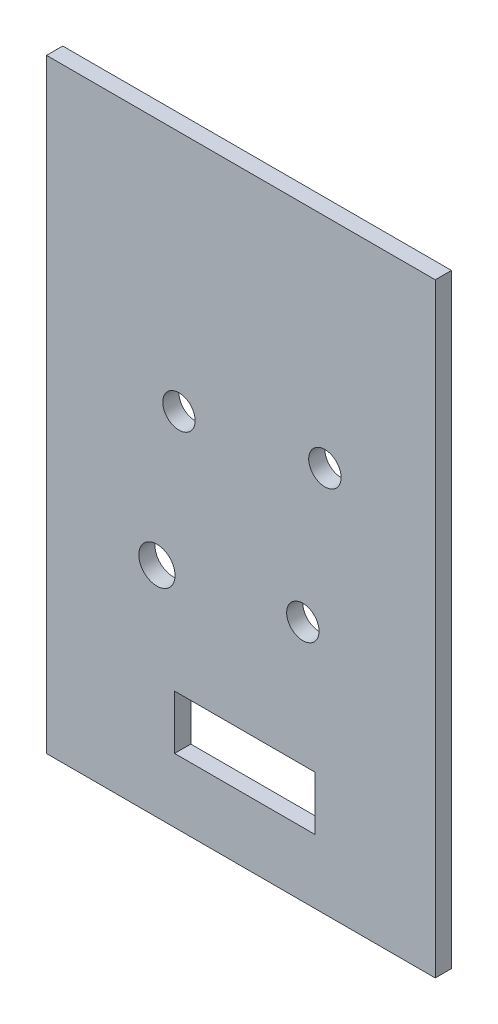
ISO-10303-21;
HEADER;
FILE_DESCRIPTION(('STEP AP214'),'2;1');
FILE_NAME('part.step','',(''),(''),'','','');
FILE_SCHEMA(('AUTOMOTIVE_DESIGN { 1 0 10303 214 1 1 1 1 }'));
ENDSEC;
DATA;
#1=APPLICATION_CONTEXT('core data for automotive mechanical design processes');
#2=APPLICATION_PROTOCOL_DEFINITION('international standard','automotive_design',2000,#1);
#3=PRODUCT_CONTEXT('',#1,'mechanical');
#4=PRODUCT('Part','Part','',(#3));
#5=PRODUCT_RELATED_PRODUCT_CATEGORY('part','',(#4));
#6=PRODUCT_DEFINITION_FORMATION('','',#4);
#7=PRODUCT_DEFINITION_CONTEXT('part definition',#1,'design');
#8=PRODUCT_DEFINITION('design','',#6,#7);
#9=PRODUCT_DEFINITION_SHAPE('','',#8);
#10=(LENGTH_UNIT() NAMED_UNIT(*) SI_UNIT(.MILLI.,.METRE.));
#11=(NAMED_UNIT(*) PLANE_ANGLE_UNIT() SI_UNIT($,.RADIAN.));
#12=(NAMED_UNIT(*) SI_UNIT($,.STERADIAN.) SOLID_ANGLE_UNIT());
#13=UNCERTAINTY_MEASURE_WITH_UNIT(LENGTH_MEASURE(1.E-05),#10,'distance_accuracy_value','');
#14=(GEOMETRIC_REPRESENTATION_CONTEXT(3) GLOBAL_UNCERTAINTY_ASSIGNED_CONTEXT((#13)) GLOBAL_UNIT_ASSIGNED_CONTEXT((#10,
#11,#12)) REPRESENTATION_CONTEXT('',''));
#15=CARTESIAN_POINT('',(0.,0.,0.));
#16=DIRECTION('',(0.,0.,1.));
#17=DIRECTION('',(1.,0.,0.));
#18=AXIS2_PLACEMENT_3D('',#15,#16,#17);
#19=CARTESIAN_POINT('',(0.,0.,1.5));
#20=DIRECTION('',(0.,0.,1.));
#21=DIRECTION('',(1.,0.,0.));
#22=AXIS2_PLACEMENT_3D('',#19,#20,#21);
#23=PLANE('',#22);
#24=CARTESIAN_POINT('',(-7.77817459305202,-7.77817459305202,1.5));
#25=DIRECTION('',(0.,0.,1.));
#26=DIRECTION('',(1.,0.,0.));
#27=AXIS2_PLACEMENT_3D('',#24,#25,#26);
#28=CIRCLE('',#27,1.6804092266645);
#29=CARTESIAN_POINT('',(-6.09776536638752,-7.77817459305202,1.5));
#30=VERTEX_POINT('',#29);
#31=EDGE_CURVE('E367',#30,#30,#28,.T.);
#32=ORIENTED_EDGE('',*,*,#31,.F.);
#33=EDGE_LOOP('',(#32));
#34=FACE_BOUND('',#33,.T.);
#35=DIRECTION('',(1.,0.,0.));
#36=VECTOR('',#35,1.);
#37=CARTESIAN_POINT('',(-6.14148069116993,-22.0593412620467,1.5));
#38=LINE('',#37,#36);
#39=CARTESIAN_POINT('',(-6.14148069116993,-22.0593412620467,1.5));
#40=VERTEX_POINT('',#39);
#41=CARTESIAN_POINT('',(6.85851930883007,-22.0593412620467,1.5));
#42=VERTEX_POINT('',#41);
#43=EDGE_CURVE('E114',#40,#42,#38,.T.);
#44=ORIENTED_EDGE('',*,*,#43,.F.);
#45=DIRECTION('',(0.,-1.,0.));
#46=VECTOR('',#45,1.);
#47=CARTESIAN_POINT('',(-6.14148069116993,-17.0593412620467,1.5));
#48=LINE('',#47,#46);
#49=CARTESIAN_POINT('',(-6.14148069116993,-17.0593412620467,1.5));
#50=VERTEX_POINT('',#49);
#51=EDGE_CURVE('E105',#50,#40,#48,.T.);
#52=ORIENTED_EDGE('',*,*,#51,.F.);
#53=DIRECTION('',(-1.,0.,0.));
#54=VECTOR('',#53,1.);
#55=CARTESIAN_POINT('',(-6.14148069116993,-17.0593412620467,1.5));
#56=LINE('',#55,#54);
#57=CARTESIAN_POINT('',(6.85851930883007,-17.0593412620467,1.5));
#58=VERTEX_POINT('',#57);
#59=EDGE_CURVE('E132',#58,#50,#56,.T.);
#60=ORIENTED_EDGE('',*,*,#59,.F.);
#61=DIRECTION('',(0.,1.,0.));
#62=VECTOR('',#61,1.);
#63=CARTESIAN_POINT('',(6.85851930883007,-17.0593412620467,1.5));
#64=LINE('',#63,#62);
#65=EDGE_CURVE('E128',#42,#58,#64,.T.);
#66=ORIENTED_EDGE('',*,*,#65,.F.);
#67=EDGE_LOOP('',(#44,#52,#60,#66));
#68=FACE_BOUND('',#67,.T.);
#69=CARTESIAN_POINT('',(7.77817459305202,7.77817459305202,1.5));
#70=DIRECTION('',(0.,0.,1.));
#71=DIRECTION('',(1.,0.,0.));
#72=AXIS2_PLACEMENT_3D('',#69,#70,#71);
#73=CIRCLE('',#72,1.5);
#74=CARTESIAN_POINT('',(9.27817459305203,7.77817459305202,1.5));
#75=VERTEX_POINT('',#74);
#76=EDGE_CURVE('E156',#75,#75,#73,.T.);
#77=ORIENTED_EDGE('',*,*,#76,.F.);
#78=EDGE_LOOP('',(#77));
#79=FACE_BOUND('',#78,.T.);
#80=DIRECTION('',(0.,-1.,0.));
#81=VECTOR('',#80,1.);
#82=CARTESIAN_POINT('',(-18.,0.,1.5));
#83=LINE('',#82,#81);
#84=CARTESIAN_POINT('',(-18.,28.,1.5));
#85=VERTEX_POINT('',#84);
#86=CARTESIAN_POINT('',(-18.,-28.,1.5));
#87=VERTEX_POINT('',#86);
#88=EDGE_CURVE('E164',#85,#87,#83,.T.);
#89=ORIENTED_EDGE('',*,*,#88,.T.);
#90=DIRECTION('',(1.,0.,0.));
#91=VECTOR('',#90,1.);
#92=CARTESIAN_POINT('',(-18.,-28.,1.5));
#93=LINE('',#92,#91);
#94=CARTESIAN_POINT('',(18.,-28.,1.5));
#95=VERTEX_POINT('',#94);
#96=EDGE_CURVE('E168',#87,#95,#93,.T.);
#97=ORIENTED_EDGE('',*,*,#96,.T.);
#98=DIRECTION('',(0.,1.,0.));
#99=VECTOR('',#98,1.);
#100=CARTESIAN_POINT('',(18.,28.,1.5));
#101=LINE('',#100,#99);
#102=CARTESIAN_POINT('',(18.,28.,1.5));
#103=VERTEX_POINT('',#102);
#104=EDGE_CURVE('E172',#95,#103,#101,.T.);
#105=ORIENTED_EDGE('',*,*,#104,.T.);
#106=DIRECTION('',(-1.,0.,0.));
#107=VECTOR('',#106,1.);
#108=CARTESIAN_POINT('',(-18.,28.,1.5));
#109=LINE('',#108,#107);
#110=EDGE_CURVE('E175',#103,#85,#109,.T.);
#111=ORIENTED_EDGE('',*,*,#110,.T.);
#112=EDGE_LOOP('',(#89,#97,#105,#111));
#113=FACE_BOUND('',#112,.T.);
#114=CARTESIAN_POINT('',(-5.7380143603367,5.57451264242622,1.5));
#115=DIRECTION('',(0.,0.,1.));
#116=DIRECTION('',(1.,0.,0.));
#117=AXIS2_PLACEMENT_3D('',#114,#115,#116);
#118=CIRCLE('',#117,1.5);
#119=CARTESIAN_POINT('',(-4.2380143603367,5.57451264242622,1.5));
#120=VERTEX_POINT('',#119);
#121=EDGE_CURVE('E140',#120,#120,#118,.T.);
#122=ORIENTED_EDGE('',*,*,#121,.F.);
#123=EDGE_LOOP('',(#122));
#124=FACE_BOUND('',#123,.T.);
#125=CARTESIAN_POINT('',(5.73801436033698,-5.57451264242593,1.5));
#126=DIRECTION('',(0.,0.,1.));
#127=DIRECTION('',(1.,0.,0.));
#128=AXIS2_PLACEMENT_3D('',#125,#126,#127);
#129=CIRCLE('',#128,1.5);
#130=CARTESIAN_POINT('',(7.23801436033698,-5.57451264242593,1.5));
#131=VERTEX_POINT('',#130);
#132=EDGE_CURVE('E356',#131,#131,#129,.T.);
#133=ORIENTED_EDGE('',*,*,#132,.F.);
#134=EDGE_LOOP('',(#133));
#135=FACE_BOUND('',#134,.T.);
#136=ADVANCED_FACE('F39',(#34,#68,#79,#113,#124,#135),#23,.T.);
#137=CARTESIAN_POINT('',(0.,0.,0.));
#138=DIRECTION('',(0.,0.,1.));
#139=DIRECTION('',(1.,0.,0.));
#140=AXIS2_PLACEMENT_3D('',#137,#138,#139);
#141=PLANE('',#140);
#142=CARTESIAN_POINT('',(7.77817459305202,7.77817459305202,0.));
#143=DIRECTION('',(0.,0.,1.));
#144=DIRECTION('',(1.,0.,0.));
#145=AXIS2_PLACEMENT_3D('',#142,#143,#144);
#146=CIRCLE('',#145,1.5);
#147=CARTESIAN_POINT('',(9.27817459305203,7.77817459305202,0.));
#148=VERTEX_POINT('',#147);
#149=EDGE_CURVE('E123',#148,#148,#146,.T.);
#150=ORIENTED_EDGE('',*,*,#149,.T.);
#151=EDGE_LOOP('',(#150));
#152=FACE_BOUND('',#151,.T.);
#153=DIRECTION('',(1.,0.,0.));
#154=VECTOR('',#153,1.);
#155=CARTESIAN_POINT('',(-18.,-28.,0.));
#156=LINE('',#155,#154);
#157=CARTESIAN_POINT('',(-18.,-28.,0.));
#158=VERTEX_POINT('',#157);
#159=CARTESIAN_POINT('',(18.,-28.,0.));
#160=VERTEX_POINT('',#159);
#161=EDGE_CURVE('E160',#158,#160,#156,.T.);
#162=ORIENTED_EDGE('',*,*,#161,.F.);
#163=DIRECTION('',(0.,-1.,0.));
#164=VECTOR('',#163,1.);
#165=CARTESIAN_POINT('',(-18.,0.,0.));
#166=LINE('',#165,#164);
#167=CARTESIAN_POINT('',(-18.,28.,0.));
#168=VERTEX_POINT('',#167);
#169=EDGE_CURVE('E169',#168,#158,#166,.T.);
#170=ORIENTED_EDGE('',*,*,#169,.F.);
#171=DIRECTION('',(-1.,0.,0.));
#172=VECTOR('',#171,1.);
#173=CARTESIAN_POINT('',(-18.,28.,0.));
#174=LINE('',#173,#172);
#175=CARTESIAN_POINT('',(18.,28.,0.));
#176=VERTEX_POINT('',#175);
#177=EDGE_CURVE('E185',#176,#168,#174,.T.);
#178=ORIENTED_EDGE('',*,*,#177,.F.);
#179=DIRECTION('',(0.,1.,0.));
#180=VECTOR('',#179,1.);
#181=CARTESIAN_POINT('',(18.,28.,0.));
#182=LINE('',#181,#180);
#183=EDGE_CURVE('E182',#160,#176,#182,.T.);
#184=ORIENTED_EDGE('',*,*,#183,.F.);
#185=EDGE_LOOP('',(#162,#170,#178,#184));
#186=FACE_BOUND('',#185,.T.);
#187=DIRECTION('',(0.,-1.,0.));
#188=VECTOR('',#187,1.);
#189=CARTESIAN_POINT('',(-6.14148069116993,-17.0593412620467,0.));
#190=LINE('',#189,#188);
#191=CARTESIAN_POINT('',(-6.14148069116993,-17.0593412620467,0.));
#192=VERTEX_POINT('',#191);
#193=CARTESIAN_POINT('',(-6.14148069116993,-22.0593412620467,0.));
#194=VERTEX_POINT('',#193);
#195=EDGE_CURVE('E63',#192,#194,#190,.T.);
#196=ORIENTED_EDGE('',*,*,#195,.T.);
#197=DIRECTION('',(1.,0.,0.));
#198=VECTOR('',#197,1.);
#199=CARTESIAN_POINT('',(-6.14148069116993,-22.0593412620467,0.));
#200=LINE('',#199,#198);
#201=CARTESIAN_POINT('',(6.85851930883007,-22.0593412620467,0.));
#202=VERTEX_POINT('',#201);
#203=EDGE_CURVE('E121',#194,#202,#200,.T.);
#204=ORIENTED_EDGE('',*,*,#203,.T.);
#205=DIRECTION('',(0.,1.,0.));
#206=VECTOR('',#205,1.);
#207=CARTESIAN_POINT('',(6.85851930883007,-17.0593412620467,0.));
#208=LINE('',#207,#206);
#209=CARTESIAN_POINT('',(6.85851930883007,-17.0593412620467,0.));
#210=VERTEX_POINT('',#209);
#211=EDGE_CURVE('E143',#202,#210,#208,.T.);
#212=ORIENTED_EDGE('',*,*,#211,.T.);
#213=DIRECTION('',(-1.,0.,0.));
#214=VECTOR('',#213,1.);
#215=CARTESIAN_POINT('',(-6.14148069116993,-17.0593412620467,0.));
#216=LINE('',#215,#214);
#217=EDGE_CURVE('E115',#210,#192,#216,.T.);
#218=ORIENTED_EDGE('',*,*,#217,.T.);
#219=EDGE_LOOP('',(#196,#204,#212,#218));
#220=FACE_BOUND('',#219,.T.);
#221=CARTESIAN_POINT('',(-5.7380143603367,5.57451264242622,0.));
#222=DIRECTION('',(0.,0.,1.));
#223=DIRECTION('',(1.,0.,0.));
#224=AXIS2_PLACEMENT_3D('',#221,#222,#223);
#225=CIRCLE('',#224,1.5);
#226=CARTESIAN_POINT('',(-4.2380143603367,5.57451264242622,0.));
#227=VERTEX_POINT('',#226);
#228=EDGE_CURVE('E371',#227,#227,#225,.T.);
#229=ORIENTED_EDGE('',*,*,#228,.T.);
#230=EDGE_LOOP('',(#229));
#231=FACE_BOUND('',#230,.T.);
#232=CARTESIAN_POINT('',(-7.77817459305202,-7.77817459305202,0.));
#233=DIRECTION('',(0.,0.,1.));
#234=DIRECTION('',(1.,0.,0.));
#235=AXIS2_PLACEMENT_3D('',#232,#233,#234);
#236=CIRCLE('',#235,1.6804092266645);
#237=CARTESIAN_POINT('',(-6.09776536638752,-7.77817459305202,0.));
#238=VERTEX_POINT('',#237);
#239=EDGE_CURVE('E364',#238,#238,#236,.T.);
#240=ORIENTED_EDGE('',*,*,#239,.T.);
#241=EDGE_LOOP('',(#240));
#242=FACE_BOUND('',#241,.T.);
#243=CARTESIAN_POINT('',(5.73801436033698,-5.57451264242593,0.));
#244=DIRECTION('',(0.,0.,1.));
#245=DIRECTION('',(1.,0.,0.));
#246=AXIS2_PLACEMENT_3D('',#243,#244,#245);
#247=CIRCLE('',#246,1.5);
#248=CARTESIAN_POINT('',(7.23801436033698,-5.57451264242593,0.));
#249=VERTEX_POINT('',#248);
#250=EDGE_CURVE('E359',#249,#249,#247,.T.);
#251=ORIENTED_EDGE('',*,*,#250,.T.);
#252=EDGE_LOOP('',(#251));
#253=FACE_BOUND('',#252,.T.);
#254=ADVANCED_FACE('F208',(#152,#186,#220,#231,#242,#253),#141,.F.);
#255=CARTESIAN_POINT('',(-18.,-28.,1.5));
#256=DIRECTION('',(0.,1.,0.));
#257=DIRECTION('',(0.,0.,1.));
#258=AXIS2_PLACEMENT_3D('',#255,#256,#257);
#259=PLANE('',#258);
#260=ORIENTED_EDGE('',*,*,#161,.T.);
#261=DIRECTION('',(0.,0.,-1.));
#262=VECTOR('',#261,1.);
#263=CARTESIAN_POINT('',(18.,-28.,1.5));
#264=LINE('',#263,#262);
#265=EDGE_CURVE('E48',#95,#160,#264,.T.);
#266=ORIENTED_EDGE('',*,*,#265,.F.);
#267=ORIENTED_EDGE('',*,*,#96,.F.);
#268=DIRECTION('',(0.,0.,-1.));
#269=VECTOR('',#268,1.);
#270=CARTESIAN_POINT('',(-18.,-28.,1.5));
#271=LINE('',#270,#269);
#272=EDGE_CURVE('E11',#87,#158,#271,.T.);
#273=ORIENTED_EDGE('',*,*,#272,.T.);
#274=EDGE_LOOP('',(#260,#266,#267,#273));
#275=FACE_BOUND('',#274,.T.);
#276=ADVANCED_FACE('F41',(#275),#259,.F.);
#277=CARTESIAN_POINT('',(18.,28.,1.5));
#278=DIRECTION('',(-1.,0.,0.));
#279=DIRECTION('',(0.,-1.,0.));
#280=AXIS2_PLACEMENT_3D('',#277,#278,#279);
#281=PLANE('',#280);
#282=ORIENTED_EDGE('',*,*,#183,.T.);
#283=DIRECTION('',(0.,0.,-1.));
#284=VECTOR('',#283,1.);
#285=CARTESIAN_POINT('',(18.,28.,1.5));
#286=LINE('',#285,#284);
#287=EDGE_CURVE('E193',#103,#176,#286,.T.);
#288=ORIENTED_EDGE('',*,*,#287,.F.);
#289=ORIENTED_EDGE('',*,*,#104,.F.);
#290=ORIENTED_EDGE('',*,*,#265,.T.);
#291=EDGE_LOOP('',(#282,#288,#289,#290));
#292=FACE_BOUND('',#291,.T.);
#293=ADVANCED_FACE('F202',(#292),#281,.F.);
#294=CARTESIAN_POINT('',(-18.,28.,1.5));
#295=DIRECTION('',(0.,-1.,0.));
#296=DIRECTION('',(0.,0.,-1.));
#297=AXIS2_PLACEMENT_3D('',#294,#295,#296);
#298=PLANE('',#297);
#299=ORIENTED_EDGE('',*,*,#177,.T.);
#300=DIRECTION('',(0.,0.,-1.));
#301=VECTOR('',#300,1.);
#302=CARTESIAN_POINT('',(-18.,28.,1.5));
#303=LINE('',#302,#301);
#304=EDGE_CURVE('E179',#85,#168,#303,.T.);
#305=ORIENTED_EDGE('',*,*,#304,.F.);
#306=ORIENTED_EDGE('',*,*,#110,.F.);
#307=ORIENTED_EDGE('',*,*,#287,.T.);
#308=EDGE_LOOP('',(#299,#305,#306,#307));
#309=FACE_BOUND('',#308,.T.);
#310=ADVANCED_FACE('F213',(#309),#298,.F.);
#311=CARTESIAN_POINT('',(-18.,0.,1.5));
#312=DIRECTION('',(1.,0.,0.));
#313=DIRECTION('',(0.,0.,-1.));
#314=AXIS2_PLACEMENT_3D('',#311,#312,#313);
#315=PLANE('',#314);
#316=ORIENTED_EDGE('',*,*,#169,.T.);
#317=ORIENTED_EDGE('',*,*,#272,.F.);
#318=ORIENTED_EDGE('',*,*,#88,.F.);
#319=ORIENTED_EDGE('',*,*,#304,.T.);
#320=EDGE_LOOP('',(#316,#317,#318,#319));
#321=FACE_BOUND('',#320,.T.);
#322=ADVANCED_FACE('F216',(#321),#315,.F.);
#323=CARTESIAN_POINT('',(7.77817459305202,7.77817459305202,1.5));
#324=DIRECTION('',(0.,0.,-1.));
#325=DIRECTION('',(-1.,0.,0.));
#326=AXIS2_PLACEMENT_3D('',#323,#324,#325);
#327=CYLINDRICAL_SURFACE('',#326,1.5);
#328=ORIENTED_EDGE('',*,*,#76,.T.);
#329=EDGE_LOOP('',(#328));
#330=FACE_BOUND('',#329,.T.);
#331=ORIENTED_EDGE('',*,*,#149,.F.);
#332=EDGE_LOOP('',(#331));
#333=FACE_BOUND('',#332,.T.);
#334=ADVANCED_FACE('F234',(#330,#333),#327,.F.);
#335=CARTESIAN_POINT('',(-6.14148069116993,-17.0593412620467,1.5));
#336=DIRECTION('',(1.,0.,0.));
#337=DIRECTION('',(0.,1.,0.));
#338=AXIS2_PLACEMENT_3D('',#335,#336,#337);
#339=PLANE('',#338);
#340=ORIENTED_EDGE('',*,*,#195,.F.);
#341=DIRECTION('',(0.,0.,-1.));
#342=VECTOR('',#341,1.);
#343=CARTESIAN_POINT('',(-6.14148069116993,-17.0593412620467,1.5));
#344=LINE('',#343,#342);
#345=EDGE_CURVE('E109',#50,#192,#344,.T.);
#346=ORIENTED_EDGE('',*,*,#345,.F.);
#347=ORIENTED_EDGE('',*,*,#51,.T.);
#348=DIRECTION('',(0.,0.,-1.));
#349=VECTOR('',#348,1.);
#350=CARTESIAN_POINT('',(-6.14148069116993,-22.0593412620467,1.5));
#351=LINE('',#350,#349);
#352=EDGE_CURVE('E108',#40,#194,#351,.T.);
#353=ORIENTED_EDGE('',*,*,#352,.T.);
#354=EDGE_LOOP('',(#340,#346,#347,#353));
#355=FACE_BOUND('',#354,.T.);
#356=ADVANCED_FACE('F107',(#355),#339,.T.);
#357=CARTESIAN_POINT('',(-6.14148069116993,-22.0593412620467,1.5));
#358=DIRECTION('',(0.,1.,0.));
#359=DIRECTION('',(0.,0.,1.));
#360=AXIS2_PLACEMENT_3D('',#357,#358,#359);
#361=PLANE('',#360);
#362=ORIENTED_EDGE('',*,*,#203,.F.);
#363=ORIENTED_EDGE('',*,*,#352,.F.);
#364=ORIENTED_EDGE('',*,*,#43,.T.);
#365=DIRECTION('',(0.,0.,-1.));
#366=VECTOR('',#365,1.);
#367=CARTESIAN_POINT('',(6.85851930883007,-22.0593412620467,1.5));
#368=LINE('',#367,#366);
#369=EDGE_CURVE('E124',#42,#202,#368,.T.);
#370=ORIENTED_EDGE('',*,*,#369,.T.);
#371=EDGE_LOOP('',(#362,#363,#364,#370));
#372=FACE_BOUND('',#371,.T.);
#373=ADVANCED_FACE('F118',(#372),#361,.T.);
#374=CARTESIAN_POINT('',(6.85851930883007,-17.0593412620467,1.5));
#375=DIRECTION('',(-1.,0.,0.));
#376=DIRECTION('',(0.,-1.,0.));
#377=AXIS2_PLACEMENT_3D('',#374,#375,#376);
#378=PLANE('',#377);
#379=ORIENTED_EDGE('',*,*,#211,.F.);
#380=ORIENTED_EDGE('',*,*,#369,.F.);
#381=ORIENTED_EDGE('',*,*,#65,.T.);
#382=DIRECTION('',(0.,0.,-1.));
#383=VECTOR('',#382,1.);
#384=CARTESIAN_POINT('',(6.85851930883007,-17.0593412620467,1.5));
#385=LINE('',#384,#383);
#386=EDGE_CURVE('E55',#58,#210,#385,.T.);
#387=ORIENTED_EDGE('',*,*,#386,.T.);
#388=EDGE_LOOP('',(#379,#380,#381,#387));
#389=FACE_BOUND('',#388,.T.);
#390=ADVANCED_FACE('F265',(#389),#378,.T.);
#391=CARTESIAN_POINT('',(-6.14148069116993,-17.0593412620467,1.5));
#392=DIRECTION('',(0.,-1.,0.));
#393=DIRECTION('',(0.,0.,-1.));
#394=AXIS2_PLACEMENT_3D('',#391,#392,#393);
#395=PLANE('',#394);
#396=ORIENTED_EDGE('',*,*,#217,.F.);
#397=ORIENTED_EDGE('',*,*,#386,.F.);
#398=ORIENTED_EDGE('',*,*,#59,.T.);
#399=ORIENTED_EDGE('',*,*,#345,.T.);
#400=EDGE_LOOP('',(#396,#397,#398,#399));
#401=FACE_BOUND('',#400,.T.);
#402=ADVANCED_FACE('F272',(#401),#395,.T.);
#403=CARTESIAN_POINT('',(-5.7380143603367,5.57451264242622,1.5));
#404=DIRECTION('',(0.,0.,-1.));
#405=DIRECTION('',(-1.,0.,0.));
#406=AXIS2_PLACEMENT_3D('',#403,#404,#405);
#407=CYLINDRICAL_SURFACE('',#406,1.5);
#408=ORIENTED_EDGE('',*,*,#121,.T.);
#409=EDGE_LOOP('',(#408));
#410=FACE_BOUND('',#409,.T.);
#411=ORIENTED_EDGE('',*,*,#228,.F.);
#412=EDGE_LOOP('',(#411));
#413=FACE_BOUND('',#412,.T.);
#414=ADVANCED_FACE('F280',(#410,#413),#407,.F.);
#415=CARTESIAN_POINT('',(-7.77817459305202,-7.77817459305202,1.5));
#416=DIRECTION('',(0.,0.,-1.));
#417=DIRECTION('',(-1.,0.,0.));
#418=AXIS2_PLACEMENT_3D('',#415,#416,#417);
#419=CYLINDRICAL_SURFACE('',#418,1.6804092266645);
#420=ORIENTED_EDGE('',*,*,#31,.T.);
#421=EDGE_LOOP('',(#420));
#422=FACE_BOUND('',#421,.T.);
#423=ORIENTED_EDGE('',*,*,#239,.F.);
#424=EDGE_LOOP('',(#423));
#425=FACE_BOUND('',#424,.T.);
#426=ADVANCED_FACE('F287',(#422,#425),#419,.F.);
#427=CARTESIAN_POINT('',(5.73801436033698,-5.57451264242593,1.5));
#428=DIRECTION('',(0.,0.,-1.));
#429=DIRECTION('',(-1.,0.,0.));
#430=AXIS2_PLACEMENT_3D('',#427,#428,#429);
#431=CYLINDRICAL_SURFACE('',#430,1.5);
#432=ORIENTED_EDGE('',*,*,#132,.T.);
#433=EDGE_LOOP('',(#432));
#434=FACE_BOUND('',#433,.T.);
#435=ORIENTED_EDGE('',*,*,#250,.F.);
#436=EDGE_LOOP('',(#435));
#437=FACE_BOUND('',#436,.T.);
#438=ADVANCED_FACE('F295',(#434,#437),#431,.F.);
#439=CLOSED_SHELL('',(#136,#254,#276,#293,#310,#322,#334,#356,#373,#390,#402,#414,#426,#438));
#440=MANIFOLD_SOLID_BREP('B2',#439);
#441=ADVANCED_BREP_SHAPE_REPRESENTATION('',(#18,#440),#14);
#442=SHAPE_DEFINITION_REPRESENTATION(#9,#441);
ENDSEC;
END-ISO-10303-21;
